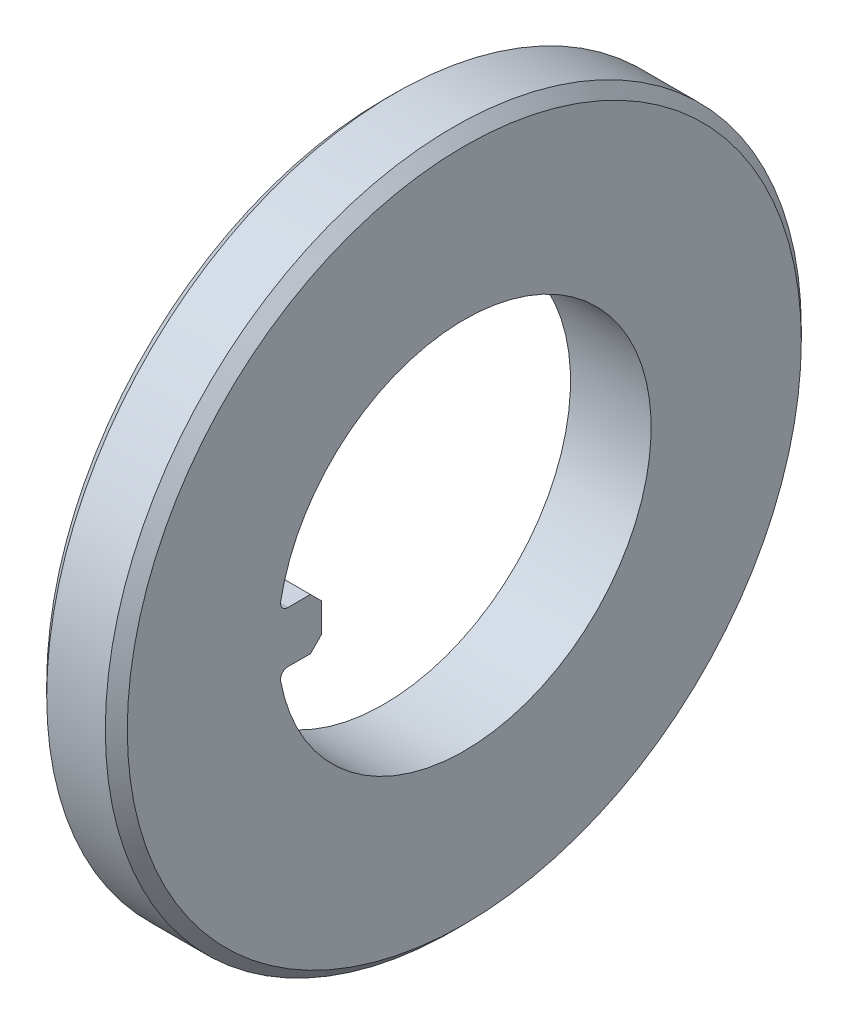
ISO-10303-21;
HEADER;
FILE_DESCRIPTION(('STEP AP214'),'2;1');
FILE_NAME('part.step','',(''),(''),'','','');
FILE_SCHEMA(('AUTOMOTIVE_DESIGN { 1 0 10303 214 1 1 1 1 }'));
ENDSEC;
DATA;
#1=APPLICATION_CONTEXT('core data for automotive mechanical design processes');
#2=APPLICATION_PROTOCOL_DEFINITION('international standard','automotive_design',2000,#1);
#3=PRODUCT_CONTEXT('',#1,'mechanical');
#4=PRODUCT('Part','Part','',(#3));
#5=PRODUCT_RELATED_PRODUCT_CATEGORY('part','',(#4));
#6=PRODUCT_DEFINITION_FORMATION('','',#4);
#7=PRODUCT_DEFINITION_CONTEXT('part definition',#1,'design');
#8=PRODUCT_DEFINITION('design','',#6,#7);
#9=PRODUCT_DEFINITION_SHAPE('','',#8);
#10=(LENGTH_UNIT() NAMED_UNIT(*) SI_UNIT(.MILLI.,.METRE.));
#11=(NAMED_UNIT(*) PLANE_ANGLE_UNIT() SI_UNIT($,.RADIAN.));
#12=(NAMED_UNIT(*) SI_UNIT($,.STERADIAN.) SOLID_ANGLE_UNIT());
#13=UNCERTAINTY_MEASURE_WITH_UNIT(LENGTH_MEASURE(1.E-05),#10,'distance_accuracy_value','');
#14=(GEOMETRIC_REPRESENTATION_CONTEXT(3) GLOBAL_UNCERTAINTY_ASSIGNED_CONTEXT((#13)) GLOBAL_UNIT_ASSIGNED_CONTEXT((#10,
#11,#12)) REPRESENTATION_CONTEXT('',''));
#15=CARTESIAN_POINT('',(0.,0.,0.));
#16=DIRECTION('',(0.,0.,1.));
#17=DIRECTION('',(1.,0.,0.));
#18=AXIS2_PLACEMENT_3D('',#15,#16,#17);
#19=CARTESIAN_POINT('',(4.4,0.,0.));
#20=DIRECTION('',(1.,0.,0.));
#21=DIRECTION('',(0.,0.,-1.));
#22=AXIS2_PLACEMENT_3D('',#19,#20,#21);
#23=PLANE('',#22);
#24=CARTESIAN_POINT('',(4.4,0.,0.));
#25=DIRECTION('',(1.,0.,0.));
#26=DIRECTION('',(0.,0.,-1.));
#27=AXIS2_PLACEMENT_3D('',#24,#25,#26);
#28=CIRCLE('',#27,18.4);
#29=CARTESIAN_POINT('',(4.4,0.,-18.4));
#30=VERTEX_POINT('',#29);
#31=EDGE_CURVE('E124',#30,#30,#28,.T.);
#32=ORIENTED_EDGE('',*,*,#31,.T.);
#33=EDGE_LOOP('',(#32));
#34=FACE_BOUND('',#33,.T.);
#35=DIRECTION('',(0.,-1.,0.));
#36=VECTOR('',#35,1.);
#37=CARTESIAN_POINT('',(4.4,1.4,7.8));
#38=LINE('',#37,#36);
#39=CARTESIAN_POINT('',(4.4,0.800000000000004,7.8));
#40=VERTEX_POINT('',#39);
#41=CARTESIAN_POINT('',(4.4,-0.800000000000004,7.8));
#42=VERTEX_POINT('',#41);
#43=EDGE_CURVE('E172',#40,#42,#38,.T.);
#44=ORIENTED_EDGE('',*,*,#43,.F.);
#45=DIRECTION('',(0.,-0.707106781186547,-0.707106781186548));
#46=VECTOR('',#45,1.);
#47=CARTESIAN_POINT('',(4.4,-3.5,3.5));
#48=LINE('',#47,#46);
#49=CARTESIAN_POINT('',(4.4,1.4,8.4));
#50=VERTEX_POINT('',#49);
#51=EDGE_CURVE('E137',#40,#50,#48,.F.);
#52=ORIENTED_EDGE('',*,*,#51,.T.);
#53=DIRECTION('',(0.,0.,-1.));
#54=VECTOR('',#53,1.);
#55=CARTESIAN_POINT('',(4.4,1.4,10.1034647522521));
#56=LINE('',#55,#54);
#57=CARTESIAN_POINT('',(4.4,1.4,9.63327566303384));
#58=VERTEX_POINT('',#57);
#59=EDGE_CURVE('E122',#58,#50,#56,.T.);
#60=ORIENTED_EDGE('',*,*,#59,.F.);
#61=CARTESIAN_POINT('',(4.4,1.8,9.63327566303384));
#62=DIRECTION('',(1.,0.,0.));
#63=DIRECTION('',(0.,0.,-1.));
#64=AXIS2_PLACEMENT_3D('',#61,#62,#63);
#65=CIRCLE('',#64,0.4);
#66=CARTESIAN_POINT('',(4.4,1.8734693877551,10.0264705880556));
#67=VERTEX_POINT('',#66);
#68=EDGE_CURVE('E11',#58,#67,#65,.F.);
#69=ORIENTED_EDGE('',*,*,#68,.T.);
#70=CARTESIAN_POINT('',(4.4,0.,0.));
#71=DIRECTION('',(1.,0.,0.));
#72=DIRECTION('',(0.,0.,-1.));
#73=AXIS2_PLACEMENT_3D('',#70,#71,#72);
#74=CIRCLE('',#73,10.2);
#75=CARTESIAN_POINT('',(4.4,-1.8734693877551,10.0264705880556));
#76=VERTEX_POINT('',#75);
#77=EDGE_CURVE('E162',#76,#67,#74,.T.);
#78=ORIENTED_EDGE('',*,*,#77,.F.);
#79=CARTESIAN_POINT('',(4.4,-1.8,9.63327566303384));
#80=DIRECTION('',(1.,0.,0.));
#81=DIRECTION('',(0.,0.,-1.));
#82=AXIS2_PLACEMENT_3D('',#79,#80,#81);
#83=CIRCLE('',#82,0.4);
#84=CARTESIAN_POINT('',(4.4,-1.4,9.63327566303384));
#85=VERTEX_POINT('',#84);
#86=EDGE_CURVE('E152',#76,#85,#83,.F.);
#87=ORIENTED_EDGE('',*,*,#86,.T.);
#88=DIRECTION('',(0.,0.,1.));
#89=VECTOR('',#88,1.);
#90=CARTESIAN_POINT('',(4.4,-1.4,10.1034647522521));
#91=LINE('',#90,#89);
#92=CARTESIAN_POINT('',(4.4,-1.4,8.4));
#93=VERTEX_POINT('',#92);
#94=EDGE_CURVE('E159',#93,#85,#91,.T.);
#95=ORIENTED_EDGE('',*,*,#94,.F.);
#96=DIRECTION('',(0.,-0.707106781186547,0.707106781186548));
#97=VECTOR('',#96,1.);
#98=CARTESIAN_POINT('',(4.4,3.5,3.5));
#99=LINE('',#98,#97);
#100=EDGE_CURVE('E135',#93,#42,#99,.F.);
#101=ORIENTED_EDGE('',*,*,#100,.T.);
#102=EDGE_LOOP('',(#44,#52,#60,#69,#78,#87,#95,#101));
#103=FACE_BOUND('',#102,.T.);
#104=ADVANCED_FACE('F41',(#34,#103),#23,.T.);
#105=CARTESIAN_POINT('',(0.,0.,0.));
#106=DIRECTION('',(1.,0.,0.));
#107=DIRECTION('',(0.,0.,-1.));
#108=AXIS2_PLACEMENT_3D('',#105,#106,#107);
#109=PLANE('',#108);
#110=CARTESIAN_POINT('',(0.,0.,0.));
#111=DIRECTION('',(1.,0.,0.));
#112=DIRECTION('',(0.,0.,-1.));
#113=AXIS2_PLACEMENT_3D('',#110,#111,#112);
#114=CIRCLE('',#113,18.4);
#115=CARTESIAN_POINT('',(0.,0.,-18.4));
#116=VERTEX_POINT('',#115);
#117=EDGE_CURVE('E128',#116,#116,#114,.F.);
#118=ORIENTED_EDGE('',*,*,#117,.T.);
#119=EDGE_LOOP('',(#118));
#120=FACE_BOUND('',#119,.T.);
#121=CARTESIAN_POINT('',(0.,0.,0.));
#122=DIRECTION('',(1.,0.,0.));
#123=DIRECTION('',(0.,0.,-1.));
#124=AXIS2_PLACEMENT_3D('',#121,#122,#123);
#125=CIRCLE('',#124,10.2);
#126=CARTESIAN_POINT('',(0.,-1.8734693877551,10.0264705880556));
#127=VERTEX_POINT('',#126);
#128=CARTESIAN_POINT('',(0.,1.8734693877551,10.0264705880556));
#129=VERTEX_POINT('',#128);
#130=EDGE_CURVE('E109',#127,#129,#125,.T.);
#131=ORIENTED_EDGE('',*,*,#130,.T.);
#132=CARTESIAN_POINT('',(0.,1.8,9.63327566303384));
#133=DIRECTION('',(1.,0.,0.));
#134=DIRECTION('',(0.,0.,-1.));
#135=AXIS2_PLACEMENT_3D('',#132,#133,#134);
#136=CIRCLE('',#135,0.4);
#137=CARTESIAN_POINT('',(0.,1.4,9.63327566303384));
#138=VERTEX_POINT('',#137);
#139=EDGE_CURVE('E49',#129,#138,#136,.T.);
#140=ORIENTED_EDGE('',*,*,#139,.T.);
#141=DIRECTION('',(0.,0.,-1.));
#142=VECTOR('',#141,1.);
#143=CARTESIAN_POINT('',(0.,1.4,10.1034647522521));
#144=LINE('',#143,#142);
#145=CARTESIAN_POINT('',(0.,1.4,8.4));
#146=VERTEX_POINT('',#145);
#147=EDGE_CURVE('E101',#138,#146,#144,.T.);
#148=ORIENTED_EDGE('',*,*,#147,.T.);
#149=DIRECTION('',(0.,0.707106781186547,0.707106781186548));
#150=VECTOR('',#149,1.);
#151=CARTESIAN_POINT('',(0.,1.4,8.4));
#152=LINE('',#151,#150);
#153=CARTESIAN_POINT('',(0.,0.800000000000004,7.8));
#154=VERTEX_POINT('',#153);
#155=EDGE_CURVE('E105',#146,#154,#152,.F.);
#156=ORIENTED_EDGE('',*,*,#155,.T.);
#157=DIRECTION('',(0.,-1.,0.));
#158=VECTOR('',#157,1.);
#159=CARTESIAN_POINT('',(0.,1.4,7.8));
#160=LINE('',#159,#158);
#161=CARTESIAN_POINT('',(0.,-0.800000000000004,7.8));
#162=VERTEX_POINT('',#161);
#163=EDGE_CURVE('E108',#154,#162,#160,.T.);
#164=ORIENTED_EDGE('',*,*,#163,.T.);
#165=DIRECTION('',(0.,0.707106781186547,-0.707106781186548));
#166=VECTOR('',#165,1.);
#167=CARTESIAN_POINT('',(0.,-0.800000000000004,7.8));
#168=LINE('',#167,#166);
#169=CARTESIAN_POINT('',(0.,-1.4,8.4));
#170=VERTEX_POINT('',#169);
#171=EDGE_CURVE('E119',#162,#170,#168,.F.);
#172=ORIENTED_EDGE('',*,*,#171,.T.);
#173=DIRECTION('',(0.,0.,1.));
#174=VECTOR('',#173,1.);
#175=CARTESIAN_POINT('',(0.,-1.4,10.1034647522521));
#176=LINE('',#175,#174);
#177=CARTESIAN_POINT('',(0.,-1.4,9.63327566303384));
#178=VERTEX_POINT('',#177);
#179=EDGE_CURVE('E176',#170,#178,#176,.T.);
#180=ORIENTED_EDGE('',*,*,#179,.T.);
#181=CARTESIAN_POINT('',(0.,-1.8,9.63327566303384));
#182=DIRECTION('',(1.,0.,0.));
#183=DIRECTION('',(0.,0.,-1.));
#184=AXIS2_PLACEMENT_3D('',#181,#182,#183);
#185=CIRCLE('',#184,0.4);
#186=EDGE_CURVE('E150',#178,#127,#185,.T.);
#187=ORIENTED_EDGE('',*,*,#186,.T.);
#188=EDGE_LOOP('',(#131,#140,#148,#156,#164,#172,#180,#187));
#189=FACE_BOUND('',#188,.T.);
#190=ADVANCED_FACE('F103',(#120,#189),#109,.F.);
#191=CARTESIAN_POINT('',(4.4,0.,0.));
#192=DIRECTION('',(-1.,0.,0.));
#193=DIRECTION('',(0.,0.,1.));
#194=AXIS2_PLACEMENT_3D('',#191,#192,#193);
#195=CYLINDRICAL_SURFACE('',#194,19.);
#196=CARTESIAN_POINT('',(0.599999999999993,0.,0.));
#197=DIRECTION('',(1.,0.,0.));
#198=DIRECTION('',(0.,0.,-1.));
#199=AXIS2_PLACEMENT_3D('',#196,#197,#198);
#200=CIRCLE('',#199,19.);
#201=CARTESIAN_POINT('',(0.599999999999993,0.,-19.));
#202=VERTEX_POINT('',#201);
#203=EDGE_CURVE('E187',#202,#202,#200,.T.);
#204=ORIENTED_EDGE('',*,*,#203,.T.);
#205=EDGE_LOOP('',(#204));
#206=FACE_BOUND('',#205,.T.);
#207=CARTESIAN_POINT('',(3.79999999999999,0.,0.));
#208=DIRECTION('',(1.,0.,0.));
#209=DIRECTION('',(0.,0.,-1.));
#210=AXIS2_PLACEMENT_3D('',#207,#208,#209);
#211=CIRCLE('',#210,19.);
#212=CARTESIAN_POINT('',(3.79999999999999,0.,-19.));
#213=VERTEX_POINT('',#212);
#214=EDGE_CURVE('E171',#213,#213,#211,.F.);
#215=ORIENTED_EDGE('',*,*,#214,.T.);
#216=EDGE_LOOP('',(#215));
#217=FACE_BOUND('',#216,.T.);
#218=ADVANCED_FACE('F200',(#206,#217),#195,.T.);
#219=CARTESIAN_POINT('',(4.4,0.,0.));
#220=DIRECTION('',(-1.,0.,0.));
#221=DIRECTION('',(0.,0.,1.));
#222=AXIS2_PLACEMENT_3D('',#219,#220,#221);
#223=CYLINDRICAL_SURFACE('',#222,10.2);
#224=ORIENTED_EDGE('',*,*,#130,.F.);
#225=DIRECTION('',(-1.,0.,0.));
#226=VECTOR('',#225,1.);
#227=CARTESIAN_POINT('',(4.4,-1.8734693877551,10.0264705880556));
#228=LINE('',#227,#226);
#229=EDGE_CURVE('E147',#127,#76,#228,.F.);
#230=ORIENTED_EDGE('',*,*,#229,.T.);
#231=ORIENTED_EDGE('',*,*,#77,.T.);
#232=DIRECTION('',(-1.,0.,0.));
#233=VECTOR('',#232,1.);
#234=CARTESIAN_POINT('',(4.4,1.8734693877551,10.0264705880556));
#235=LINE('',#234,#233);
#236=EDGE_CURVE('E144',#67,#129,#235,.T.);
#237=ORIENTED_EDGE('',*,*,#236,.T.);
#238=EDGE_LOOP('',(#224,#230,#231,#237));
#239=FACE_BOUND('',#238,.T.);
#240=ADVANCED_FACE('F178',(#239),#223,.F.);
#241=CARTESIAN_POINT('',(4.4,1.4,10.1034647522521));
#242=DIRECTION('',(0.,1.,0.));
#243=DIRECTION('',(0.,0.,1.));
#244=AXIS2_PLACEMENT_3D('',#241,#242,#243);
#245=PLANE('',#244);
#246=ORIENTED_EDGE('',*,*,#147,.F.);
#247=DIRECTION('',(1.,0.,0.));
#248=VECTOR('',#247,1.);
#249=CARTESIAN_POINT('',(4.4,1.4,9.63327566303384));
#250=LINE('',#249,#248);
#251=EDGE_CURVE('E62',#138,#58,#250,.T.);
#252=ORIENTED_EDGE('',*,*,#251,.T.);
#253=ORIENTED_EDGE('',*,*,#59,.T.);
#254=DIRECTION('',(-1.,0.,0.));
#255=VECTOR('',#254,1.);
#256=CARTESIAN_POINT('',(4.4,1.4,8.4));
#257=LINE('',#256,#255);
#258=EDGE_CURVE('E116',#50,#146,#257,.T.);
#259=ORIENTED_EDGE('',*,*,#258,.T.);
#260=EDGE_LOOP('',(#246,#252,#253,#259));
#261=FACE_BOUND('',#260,.T.);
#262=ADVANCED_FACE('F121',(#261),#245,.T.);
#263=CARTESIAN_POINT('',(4.4,1.4,7.8));
#264=DIRECTION('',(0.,0.,-1.));
#265=DIRECTION('',(-1.,0.,0.));
#266=AXIS2_PLACEMENT_3D('',#263,#264,#265);
#267=PLANE('',#266);
#268=ORIENTED_EDGE('',*,*,#163,.F.);
#269=DIRECTION('',(1.,0.,0.));
#270=VECTOR('',#269,1.);
#271=CARTESIAN_POINT('',(4.4,0.800000000000004,7.8));
#272=LINE('',#271,#270);
#273=EDGE_CURVE('E117',#154,#40,#272,.T.);
#274=ORIENTED_EDGE('',*,*,#273,.T.);
#275=ORIENTED_EDGE('',*,*,#43,.T.);
#276=DIRECTION('',(-1.,0.,0.));
#277=VECTOR('',#276,1.);
#278=CARTESIAN_POINT('',(4.4,-0.800000000000004,7.8));
#279=LINE('',#278,#277);
#280=EDGE_CURVE('E118',#42,#162,#279,.T.);
#281=ORIENTED_EDGE('',*,*,#280,.T.);
#282=EDGE_LOOP('',(#268,#274,#275,#281));
#283=FACE_BOUND('',#282,.T.);
#284=ADVANCED_FACE('F251',(#283),#267,.T.);
#285=CARTESIAN_POINT('',(4.4,-1.4,10.1034647522521));
#286=DIRECTION('',(0.,-1.,0.));
#287=DIRECTION('',(0.,0.,-1.));
#288=AXIS2_PLACEMENT_3D('',#285,#286,#287);
#289=PLANE('',#288);
#290=ORIENTED_EDGE('',*,*,#94,.T.);
#291=DIRECTION('',(1.,0.,0.));
#292=VECTOR('',#291,1.);
#293=CARTESIAN_POINT('',(0.,-1.4,9.63327566303384));
#294=LINE('',#293,#292);
#295=EDGE_CURVE('E141',#85,#178,#294,.F.);
#296=ORIENTED_EDGE('',*,*,#295,.T.);
#297=ORIENTED_EDGE('',*,*,#179,.F.);
#298=DIRECTION('',(1.,0.,0.));
#299=VECTOR('',#298,1.);
#300=CARTESIAN_POINT('',(4.4,-1.4,8.4));
#301=LINE('',#300,#299);
#302=EDGE_CURVE('E139',#170,#93,#301,.T.);
#303=ORIENTED_EDGE('',*,*,#302,.T.);
#304=EDGE_LOOP('',(#290,#296,#297,#303));
#305=FACE_BOUND('',#304,.T.);
#306=ADVANCED_FACE('F167',(#305),#289,.T.);
#307=CARTESIAN_POINT('',(0.599999999999993,0.,0.));
#308=DIRECTION('',(1.,0.,0.));
#309=DIRECTION('',(0.,0.,-1.));
#310=AXIS2_PLACEMENT_3D('',#307,#308,#309);
#311=CONICAL_SURFACE('',#310,19.,0.785398163397451);
#312=ORIENTED_EDGE('',*,*,#117,.F.);
#313=EDGE_LOOP('',(#312));
#314=FACE_BOUND('',#313,.T.);
#315=ORIENTED_EDGE('',*,*,#203,.F.);
#316=EDGE_LOOP('',(#315));
#317=FACE_BOUND('',#316,.T.);
#318=ADVANCED_FACE('F193',(#314,#317),#311,.T.);
#319=CARTESIAN_POINT('',(4.4,0.,0.));
#320=DIRECTION('',(-1.,0.,0.));
#321=DIRECTION('',(0.,0.,1.));
#322=AXIS2_PLACEMENT_3D('',#319,#320,#321);
#323=CONICAL_SURFACE('',#322,18.4,0.785398163397443);
#324=ORIENTED_EDGE('',*,*,#214,.F.);
#325=EDGE_LOOP('',(#324));
#326=FACE_BOUND('',#325,.T.);
#327=ORIENTED_EDGE('',*,*,#31,.F.);
#328=EDGE_LOOP('',(#327));
#329=FACE_BOUND('',#328,.T.);
#330=ADVANCED_FACE('F196',(#326,#329),#323,.T.);
#331=CARTESIAN_POINT('',(4.4,1.4,8.4));
#332=DIRECTION('',(0.,-0.707106781186547,0.707106781186547));
#333=DIRECTION('',(-1.,0.,0.));
#334=AXIS2_PLACEMENT_3D('',#331,#332,#333);
#335=PLANE('',#334);
#336=ORIENTED_EDGE('',*,*,#51,.F.);
#337=ORIENTED_EDGE('',*,*,#273,.F.);
#338=ORIENTED_EDGE('',*,*,#155,.F.);
#339=ORIENTED_EDGE('',*,*,#258,.F.);
#340=EDGE_LOOP('',(#336,#337,#338,#339));
#341=FACE_BOUND('',#340,.T.);
#342=ADVANCED_FACE('F115',(#341),#335,.F.);
#343=CARTESIAN_POINT('',(4.4,-0.800000000000004,7.8));
#344=DIRECTION('',(0.,0.707106781186548,0.707106781186547));
#345=DIRECTION('',(-1.,0.,0.));
#346=AXIS2_PLACEMENT_3D('',#343,#344,#345);
#347=PLANE('',#346);
#348=ORIENTED_EDGE('',*,*,#100,.F.);
#349=ORIENTED_EDGE('',*,*,#302,.F.);
#350=ORIENTED_EDGE('',*,*,#171,.F.);
#351=ORIENTED_EDGE('',*,*,#280,.F.);
#352=EDGE_LOOP('',(#348,#349,#350,#351));
#353=FACE_BOUND('',#352,.T.);
#354=ADVANCED_FACE('F233',(#353),#347,.F.);
#355=CARTESIAN_POINT('',(4.4,-1.8,9.63327566303384));
#356=DIRECTION('',(-1.,0.,0.));
#357=DIRECTION('',(0.,0.,1.));
#358=AXIS2_PLACEMENT_3D('',#355,#356,#357);
#359=CYLINDRICAL_SURFACE('',#358,0.4);
#360=ORIENTED_EDGE('',*,*,#86,.F.);
#361=ORIENTED_EDGE('',*,*,#229,.F.);
#362=ORIENTED_EDGE('',*,*,#186,.F.);
#363=ORIENTED_EDGE('',*,*,#295,.F.);
#364=EDGE_LOOP('',(#360,#361,#362,#363));
#365=FACE_BOUND('',#364,.T.);
#366=ADVANCED_FACE('F174',(#365),#359,.F.);
#367=CARTESIAN_POINT('',(4.4,1.8,9.63327566303384));
#368=DIRECTION('',(-1.,0.,0.));
#369=DIRECTION('',(0.,0.,1.));
#370=AXIS2_PLACEMENT_3D('',#367,#368,#369);
#371=CYLINDRICAL_SURFACE('',#370,0.4);
#372=ORIENTED_EDGE('',*,*,#68,.F.);
#373=ORIENTED_EDGE('',*,*,#251,.F.);
#374=ORIENTED_EDGE('',*,*,#139,.F.);
#375=ORIENTED_EDGE('',*,*,#236,.F.);
#376=EDGE_LOOP('',(#372,#373,#374,#375));
#377=FACE_BOUND('',#376,.T.);
#378=ADVANCED_FACE('F43',(#377),#371,.F.);
#379=CLOSED_SHELL('',(#104,#190,#218,#240,#262,#284,#306,#318,#330,#342,#354,#366,#378));
#380=MANIFOLD_SOLID_BREP('B2',#379);
#381=ADVANCED_BREP_SHAPE_REPRESENTATION('',(#18,#380),#14);
#382=SHAPE_DEFINITION_REPRESENTATION(#9,#381);
ENDSEC;
END-ISO-10303-21;
